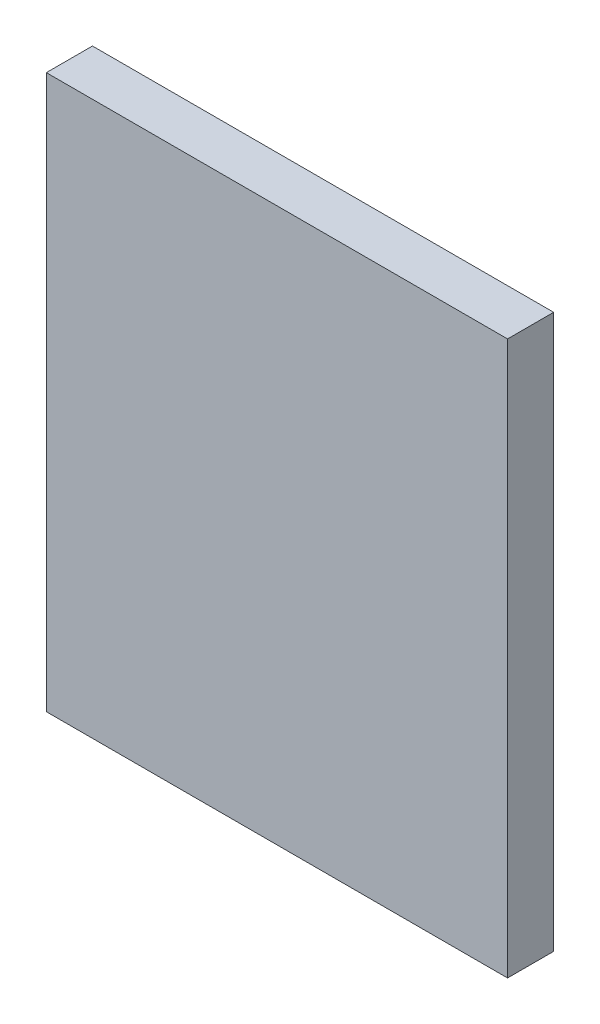
ISO-10303-21;
HEADER;
FILE_DESCRIPTION(('STEP AP214'),'2;1');
FILE_NAME('part.step','',(''),(''),'','','');
FILE_SCHEMA(('AUTOMOTIVE_DESIGN { 1 0 10303 214 1 1 1 1 }'));
ENDSEC;
DATA;
#1=APPLICATION_CONTEXT('core data for automotive mechanical design processes');
#2=APPLICATION_PROTOCOL_DEFINITION('international standard','automotive_design',2000,#1);
#3=PRODUCT_CONTEXT('',#1,'mechanical');
#4=PRODUCT('Part','Part','',(#3));
#5=PRODUCT_RELATED_PRODUCT_CATEGORY('part','',(#4));
#6=PRODUCT_DEFINITION_FORMATION('','',#4);
#7=PRODUCT_DEFINITION_CONTEXT('part definition',#1,'design');
#8=PRODUCT_DEFINITION('design','',#6,#7);
#9=PRODUCT_DEFINITION_SHAPE('','',#8);
#10=(LENGTH_UNIT() NAMED_UNIT(*) SI_UNIT(.MILLI.,.METRE.));
#11=(NAMED_UNIT(*) PLANE_ANGLE_UNIT() SI_UNIT($,.RADIAN.));
#12=(NAMED_UNIT(*) SI_UNIT($,.STERADIAN.) SOLID_ANGLE_UNIT());
#13=UNCERTAINTY_MEASURE_WITH_UNIT(LENGTH_MEASURE(1.E-05),#10,'distance_accuracy_value','');
#14=(GEOMETRIC_REPRESENTATION_CONTEXT(3) GLOBAL_UNCERTAINTY_ASSIGNED_CONTEXT((#13)) GLOBAL_UNIT_ASSIGNED_CONTEXT((#10,
#11,#12)) REPRESENTATION_CONTEXT('',''));
#15=CARTESIAN_POINT('',(0.,0.,0.));
#16=DIRECTION('',(0.,0.,1.));
#17=DIRECTION('',(1.,0.,0.));
#18=AXIS2_PLACEMENT_3D('',#15,#16,#17);
#19=CARTESIAN_POINT('',(0.,0.,5.));
#20=DIRECTION('',(1.,0.,0.));
#21=DIRECTION('',(0.,0.,-1.));
#22=AXIS2_PLACEMENT_3D('',#19,#20,#21);
#23=PLANE('',#22);
#24=DIRECTION('',(0.,-1.,0.));
#25=VECTOR('',#24,1.);
#26=CARTESIAN_POINT('',(0.,0.,0.));
#27=LINE('',#26,#25);
#28=CARTESIAN_POINT('',(0.,60.,0.));
#29=VERTEX_POINT('',#28);
#30=CARTESIAN_POINT('',(0.,0.,0.));
#31=VERTEX_POINT('',#30);
#32=EDGE_CURVE('E11',#29,#31,#27,.T.);
#33=ORIENTED_EDGE('',*,*,#32,.T.);
#34=DIRECTION('',(0.,0.,-1.));
#35=VECTOR('',#34,1.);
#36=CARTESIAN_POINT('',(0.,0.,5.));
#37=LINE('',#36,#35);
#38=CARTESIAN_POINT('',(0.,0.,5.));
#39=VERTEX_POINT('',#38);
#40=EDGE_CURVE('E24',#39,#31,#37,.T.);
#41=ORIENTED_EDGE('',*,*,#40,.F.);
#42=DIRECTION('',(0.,-1.,0.));
#43=VECTOR('',#42,1.);
#44=CARTESIAN_POINT('',(0.,0.,5.));
#45=LINE('',#44,#43);
#46=CARTESIAN_POINT('',(0.,60.,5.));
#47=VERTEX_POINT('',#46);
#48=EDGE_CURVE('E86',#47,#39,#45,.T.);
#49=ORIENTED_EDGE('',*,*,#48,.F.);
#50=DIRECTION('',(0.,0.,-1.));
#51=VECTOR('',#50,1.);
#52=CARTESIAN_POINT('',(0.,60.,5.));
#53=LINE('',#52,#51);
#54=EDGE_CURVE('E69',#47,#29,#53,.T.);
#55=ORIENTED_EDGE('',*,*,#54,.T.);
#56=EDGE_LOOP('',(#33,#41,#49,#55));
#57=FACE_BOUND('',#56,.T.);
#58=ADVANCED_FACE('F17',(#57),#23,.F.);
#59=CARTESIAN_POINT('',(0.,0.,5.));
#60=DIRECTION('',(0.,1.,0.));
#61=DIRECTION('',(0.,0.,1.));
#62=AXIS2_PLACEMENT_3D('',#59,#60,#61);
#63=PLANE('',#62);
#64=DIRECTION('',(1.,0.,0.));
#65=VECTOR('',#64,1.);
#66=CARTESIAN_POINT('',(0.,0.,0.));
#67=LINE('',#66,#65);
#68=CARTESIAN_POINT('',(50.,0.,0.));
#69=VERTEX_POINT('',#68);
#70=EDGE_CURVE('E83',#31,#69,#67,.T.);
#71=ORIENTED_EDGE('',*,*,#70,.T.);
#72=DIRECTION('',(0.,0.,-1.));
#73=VECTOR('',#72,1.);
#74=CARTESIAN_POINT('',(50.,0.,5.));
#75=LINE('',#74,#73);
#76=CARTESIAN_POINT('',(50.,0.,5.));
#77=VERTEX_POINT('',#76);
#78=EDGE_CURVE('E81',#77,#69,#75,.T.);
#79=ORIENTED_EDGE('',*,*,#78,.F.);
#80=DIRECTION('',(1.,0.,0.));
#81=VECTOR('',#80,1.);
#82=CARTESIAN_POINT('',(0.,0.,5.));
#83=LINE('',#82,#81);
#84=EDGE_CURVE('E75',#39,#77,#83,.T.);
#85=ORIENTED_EDGE('',*,*,#84,.F.);
#86=ORIENTED_EDGE('',*,*,#40,.T.);
#87=EDGE_LOOP('',(#71,#79,#85,#86));
#88=FACE_BOUND('',#87,.T.);
#89=ADVANCED_FACE('F89',(#88),#63,.F.);
#90=CARTESIAN_POINT('',(50.,0.,5.));
#91=DIRECTION('',(-1.,0.,0.));
#92=DIRECTION('',(0.,0.,1.));
#93=AXIS2_PLACEMENT_3D('',#90,#91,#92);
#94=PLANE('',#93);
#95=DIRECTION('',(0.,1.,0.));
#96=VECTOR('',#95,1.);
#97=CARTESIAN_POINT('',(50.,0.,0.));
#98=LINE('',#97,#96);
#99=CARTESIAN_POINT('',(50.,60.,0.));
#100=VERTEX_POINT('',#99);
#101=EDGE_CURVE('E60',#69,#100,#98,.T.);
#102=ORIENTED_EDGE('',*,*,#101,.T.);
#103=DIRECTION('',(0.,0.,-1.));
#104=VECTOR('',#103,1.);
#105=CARTESIAN_POINT('',(50.,60.,5.));
#106=LINE('',#105,#104);
#107=CARTESIAN_POINT('',(50.,60.,5.));
#108=VERTEX_POINT('',#107);
#109=EDGE_CURVE('E52',#108,#100,#106,.T.);
#110=ORIENTED_EDGE('',*,*,#109,.F.);
#111=DIRECTION('',(0.,1.,0.));
#112=VECTOR('',#111,1.);
#113=CARTESIAN_POINT('',(50.,0.,5.));
#114=LINE('',#113,#112);
#115=EDGE_CURVE('E57',#77,#108,#114,.T.);
#116=ORIENTED_EDGE('',*,*,#115,.F.);
#117=ORIENTED_EDGE('',*,*,#78,.T.);
#118=EDGE_LOOP('',(#102,#110,#116,#117));
#119=FACE_BOUND('',#118,.T.);
#120=ADVANCED_FACE('F54',(#119),#94,.F.);
#121=CARTESIAN_POINT('',(0.,60.,5.));
#122=DIRECTION('',(0.,-1.,0.));
#123=DIRECTION('',(0.,0.,-1.));
#124=AXIS2_PLACEMENT_3D('',#121,#122,#123);
#125=PLANE('',#124);
#126=DIRECTION('',(-1.,0.,0.));
#127=VECTOR('',#126,1.);
#128=CARTESIAN_POINT('',(0.,60.,0.));
#129=LINE('',#128,#127);
#130=EDGE_CURVE('E72',#100,#29,#129,.T.);
#131=ORIENTED_EDGE('',*,*,#130,.T.);
#132=ORIENTED_EDGE('',*,*,#54,.F.);
#133=DIRECTION('',(-1.,0.,0.));
#134=VECTOR('',#133,1.);
#135=CARTESIAN_POINT('',(0.,60.,5.));
#136=LINE('',#135,#134);
#137=EDGE_CURVE('E67',#108,#47,#136,.T.);
#138=ORIENTED_EDGE('',*,*,#137,.F.);
#139=ORIENTED_EDGE('',*,*,#109,.T.);
#140=EDGE_LOOP('',(#131,#132,#138,#139));
#141=FACE_BOUND('',#140,.T.);
#142=ADVANCED_FACE('F68',(#141),#125,.F.);
#143=CARTESIAN_POINT('',(0.,0.,5.));
#144=DIRECTION('',(0.,0.,-1.));
#145=DIRECTION('',(-1.,0.,0.));
#146=AXIS2_PLACEMENT_3D('',#143,#144,#145);
#147=PLANE('',#146);
#148=ORIENTED_EDGE('',*,*,#48,.T.);
#149=ORIENTED_EDGE('',*,*,#84,.T.);
#150=ORIENTED_EDGE('',*,*,#115,.T.);
#151=ORIENTED_EDGE('',*,*,#137,.T.);
#152=EDGE_LOOP('',(#148,#149,#150,#151));
#153=FACE_BOUND('',#152,.T.);
#154=ADVANCED_FACE('F74',(#153),#147,.F.);
#155=CARTESIAN_POINT('',(0.,0.,0.));
#156=DIRECTION('',(0.,0.,-1.));
#157=DIRECTION('',(-1.,0.,0.));
#158=AXIS2_PLACEMENT_3D('',#155,#156,#157);
#159=PLANE('',#158);
#160=ORIENTED_EDGE('',*,*,#32,.F.);
#161=ORIENTED_EDGE('',*,*,#130,.F.);
#162=ORIENTED_EDGE('',*,*,#101,.F.);
#163=ORIENTED_EDGE('',*,*,#70,.F.);
#164=EDGE_LOOP('',(#160,#161,#162,#163));
#165=FACE_BOUND('',#164,.T.);
#166=ADVANCED_FACE('F91',(#165),#159,.T.);
#167=CLOSED_SHELL('',(#58,#89,#120,#142,#154,#166));
#168=MANIFOLD_SOLID_BREP('B1',#167);
#169=ADVANCED_BREP_SHAPE_REPRESENTATION('',(#18,#168),#14);
#170=SHAPE_DEFINITION_REPRESENTATION(#9,#169);
ENDSEC;
END-ISO-10303-21;
